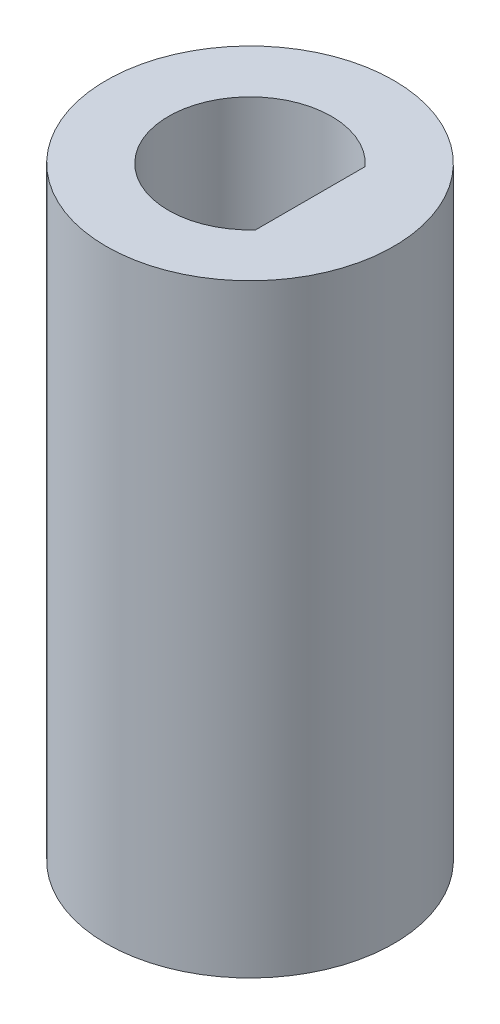
ISO-10303-21;
HEADER;
FILE_DESCRIPTION(('STEP AP214'),'2;1');
FILE_NAME('part.step','',(''),(''),'','','');
FILE_SCHEMA(('AUTOMOTIVE_DESIGN { 1 0 10303 214 1 1 1 1 }'));
ENDSEC;
DATA;
#1=APPLICATION_CONTEXT('core data for automotive mechanical design processes');
#2=APPLICATION_PROTOCOL_DEFINITION('international standard','automotive_design',2000,#1);
#3=PRODUCT_CONTEXT('',#1,'mechanical');
#4=PRODUCT('Part','Part','',(#3));
#5=PRODUCT_RELATED_PRODUCT_CATEGORY('part','',(#4));
#6=PRODUCT_DEFINITION_FORMATION('','',#4);
#7=PRODUCT_DEFINITION_CONTEXT('part definition',#1,'design');
#8=PRODUCT_DEFINITION('design','',#6,#7);
#9=PRODUCT_DEFINITION_SHAPE('','',#8);
#10=(LENGTH_UNIT() NAMED_UNIT(*) SI_UNIT(.MILLI.,.METRE.));
#11=(NAMED_UNIT(*) PLANE_ANGLE_UNIT() SI_UNIT($,.RADIAN.));
#12=(NAMED_UNIT(*) SI_UNIT($,.STERADIAN.) SOLID_ANGLE_UNIT());
#13=UNCERTAINTY_MEASURE_WITH_UNIT(LENGTH_MEASURE(1.E-05),#10,'distance_accuracy_value','');
#14=(GEOMETRIC_REPRESENTATION_CONTEXT(3) GLOBAL_UNCERTAINTY_ASSIGNED_CONTEXT((#13)) GLOBAL_UNIT_ASSIGNED_CONTEXT((#10,
#11,#12)) REPRESENTATION_CONTEXT('',''));
#15=CARTESIAN_POINT('',(0.,0.,0.));
#16=DIRECTION('',(0.,0.,1.));
#17=DIRECTION('',(1.,0.,0.));
#18=AXIS2_PLACEMENT_3D('',#15,#16,#17);
#19=CARTESIAN_POINT('',(0.,20.,0.));
#20=DIRECTION('',(0.,1.,0.));
#21=DIRECTION('',(0.,0.,1.));
#22=AXIS2_PLACEMENT_3D('',#19,#20,#21);
#23=PLANE('',#22);
#24=CARTESIAN_POINT('',(0.,20.,0.));
#25=DIRECTION('',(0.,1.,0.));
#26=DIRECTION('',(0.,0.,1.));
#27=AXIS2_PLACEMENT_3D('',#24,#25,#26);
#28=CIRCLE('',#27,4.7625);
#29=CARTESIAN_POINT('',(0.,20.,4.7625));
#30=VERTEX_POINT('',#29);
#31=EDGE_CURVE('E11',#30,#30,#28,.T.);
#32=ORIENTED_EDGE('',*,*,#31,.T.);
#33=EDGE_LOOP('',(#32));
#34=FACE_BOUND('',#33,.T.);
#35=DIRECTION('',(0.,0.,-1.));
#36=VECTOR('',#35,1.);
#37=CARTESIAN_POINT('',(2.,20.,-1.81383571472171));
#38=LINE('',#37,#36);
#39=CARTESIAN_POINT('',(2.,20.,1.81383571472171));
#40=VERTEX_POINT('',#39);
#41=CARTESIAN_POINT('',(2.,20.,-1.81383571472171));
#42=VERTEX_POINT('',#41);
#43=EDGE_CURVE('E75',#40,#42,#38,.T.);
#44=ORIENTED_EDGE('',*,*,#43,.F.);
#45=CARTESIAN_POINT('',(0.,20.,0.));
#46=DIRECTION('',(0.,1.,0.));
#47=DIRECTION('',(0.,0.,1.));
#48=AXIS2_PLACEMENT_3D('',#45,#46,#47);
#49=CIRCLE('',#48,2.7);
#50=EDGE_CURVE('E66',#42,#40,#49,.T.);
#51=ORIENTED_EDGE('',*,*,#50,.F.);
#52=EDGE_LOOP('',(#44,#51));
#53=FACE_BOUND('',#52,.T.);
#54=ADVANCED_FACE('F34',(#34,#53),#23,.T.);
#55=CARTESIAN_POINT('',(0.,0.,0.));
#56=DIRECTION('',(0.,1.,0.));
#57=DIRECTION('',(0.,0.,1.));
#58=AXIS2_PLACEMENT_3D('',#55,#56,#57);
#59=PLANE('',#58);
#60=CARTESIAN_POINT('',(0.,0.,0.));
#61=DIRECTION('',(0.,1.,0.));
#62=DIRECTION('',(0.,0.,1.));
#63=AXIS2_PLACEMENT_3D('',#60,#61,#62);
#64=CIRCLE('',#63,4.7625);
#65=CARTESIAN_POINT('',(0.,0.,4.7625));
#66=VERTEX_POINT('',#65);
#67=EDGE_CURVE('E38',#66,#66,#64,.T.);
#68=ORIENTED_EDGE('',*,*,#67,.F.);
#69=EDGE_LOOP('',(#68));
#70=FACE_BOUND('',#69,.T.);
#71=CARTESIAN_POINT('',(0.,0.,0.));
#72=DIRECTION('',(0.,1.,0.));
#73=DIRECTION('',(0.,0.,1.));
#74=AXIS2_PLACEMENT_3D('',#71,#72,#73);
#75=CIRCLE('',#74,2.7);
#76=CARTESIAN_POINT('',(2.,0.,-1.81383571472171));
#77=VERTEX_POINT('',#76);
#78=CARTESIAN_POINT('',(2.,0.,1.81383571472171));
#79=VERTEX_POINT('',#78);
#80=EDGE_CURVE('E56',#77,#79,#75,.T.);
#81=ORIENTED_EDGE('',*,*,#80,.T.);
#82=DIRECTION('',(0.,0.,-1.));
#83=VECTOR('',#82,1.);
#84=CARTESIAN_POINT('',(2.,0.,-1.81383571472171));
#85=LINE('',#84,#83);
#86=EDGE_CURVE('E62',#79,#77,#85,.T.);
#87=ORIENTED_EDGE('',*,*,#86,.T.);
#88=EDGE_LOOP('',(#81,#87));
#89=FACE_BOUND('',#88,.T.);
#90=ADVANCED_FACE('F72',(#70,#89),#59,.F.);
#91=CARTESIAN_POINT('',(0.,20.,0.));
#92=DIRECTION('',(0.,-1.,0.));
#93=DIRECTION('',(0.,0.,-1.));
#94=AXIS2_PLACEMENT_3D('',#91,#92,#93);
#95=CYLINDRICAL_SURFACE('',#94,4.7625);
#96=ORIENTED_EDGE('',*,*,#31,.F.);
#97=EDGE_LOOP('',(#96));
#98=FACE_BOUND('',#97,.T.);
#99=ORIENTED_EDGE('',*,*,#67,.T.);
#100=EDGE_LOOP('',(#99));
#101=FACE_BOUND('',#100,.T.);
#102=ADVANCED_FACE('F36',(#98,#101),#95,.T.);
#103=CARTESIAN_POINT('',(0.,20.,0.));
#104=DIRECTION('',(0.,-1.,0.));
#105=DIRECTION('',(0.,0.,-1.));
#106=AXIS2_PLACEMENT_3D('',#103,#104,#105);
#107=CYLINDRICAL_SURFACE('',#106,2.7);
#108=ORIENTED_EDGE('',*,*,#80,.F.);
#109=DIRECTION('',(0.,-1.,0.));
#110=VECTOR('',#109,1.);
#111=CARTESIAN_POINT('',(2.,20.,-1.81383571472171));
#112=LINE('',#111,#110);
#113=EDGE_CURVE('E64',#42,#77,#112,.T.);
#114=ORIENTED_EDGE('',*,*,#113,.F.);
#115=ORIENTED_EDGE('',*,*,#50,.T.);
#116=DIRECTION('',(0.,-1.,0.));
#117=VECTOR('',#116,1.);
#118=CARTESIAN_POINT('',(2.,20.,1.81383571472171));
#119=LINE('',#118,#117);
#120=EDGE_CURVE('E49',#40,#79,#119,.T.);
#121=ORIENTED_EDGE('',*,*,#120,.T.);
#122=EDGE_LOOP('',(#108,#114,#115,#121));
#123=FACE_BOUND('',#122,.T.);
#124=ADVANCED_FACE('F68',(#123),#107,.F.);
#125=CARTESIAN_POINT('',(2.,20.,-1.81383571472171));
#126=DIRECTION('',(-1.,0.,0.));
#127=DIRECTION('',(0.,0.,1.));
#128=AXIS2_PLACEMENT_3D('',#125,#126,#127);
#129=PLANE('',#128);
#130=ORIENTED_EDGE('',*,*,#86,.F.);
#131=ORIENTED_EDGE('',*,*,#120,.F.);
#132=ORIENTED_EDGE('',*,*,#43,.T.);
#133=ORIENTED_EDGE('',*,*,#113,.T.);
#134=EDGE_LOOP('',(#130,#131,#132,#133));
#135=FACE_BOUND('',#134,.T.);
#136=ADVANCED_FACE('F63',(#135),#129,.T.);
#137=CLOSED_SHELL('',(#54,#90,#102,#124,#136));
#138=MANIFOLD_SOLID_BREP('B2',#137);
#139=ADVANCED_BREP_SHAPE_REPRESENTATION('',(#18,#138),#14);
#140=SHAPE_DEFINITION_REPRESENTATION(#9,#139);
ENDSEC;
END-ISO-10303-21;
